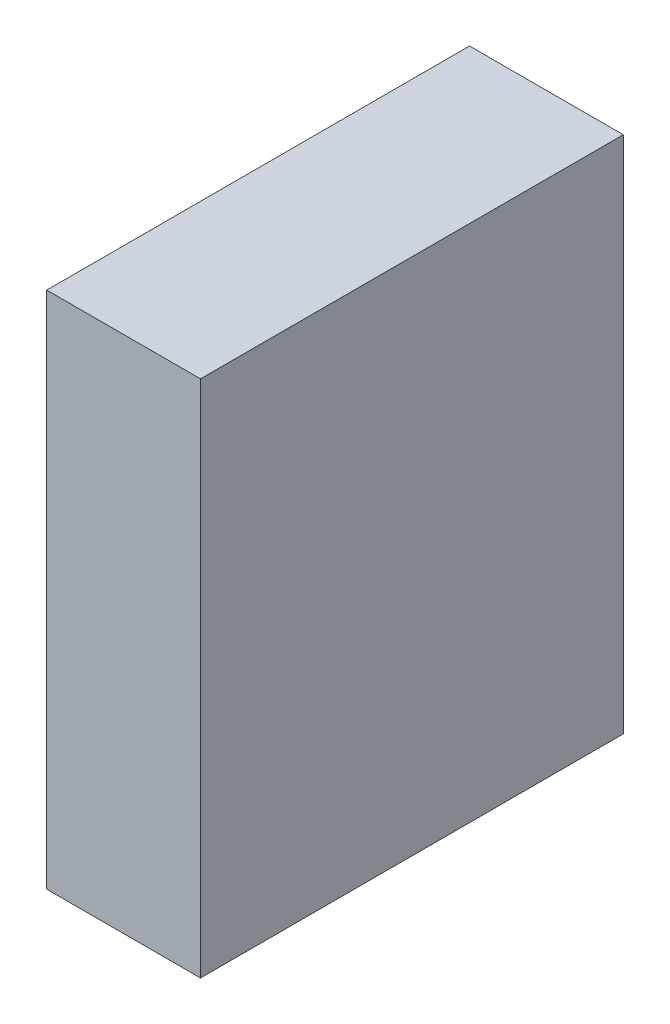
ISO-10303-21;
HEADER;
FILE_DESCRIPTION(('STEP AP214'),'2;1');
FILE_NAME('part.step','',(''),(''),'','','');
FILE_SCHEMA(('AUTOMOTIVE_DESIGN { 1 0 10303 214 1 1 1 1 }'));
ENDSEC;
DATA;
#1=APPLICATION_CONTEXT('core data for automotive mechanical design processes');
#2=APPLICATION_PROTOCOL_DEFINITION('international standard','automotive_design',2000,#1);
#3=PRODUCT_CONTEXT('',#1,'mechanical');
#4=PRODUCT('Part','Part','',(#3));
#5=PRODUCT_RELATED_PRODUCT_CATEGORY('part','',(#4));
#6=PRODUCT_DEFINITION_FORMATION('','',#4);
#7=PRODUCT_DEFINITION_CONTEXT('part definition',#1,'design');
#8=PRODUCT_DEFINITION('design','',#6,#7);
#9=PRODUCT_DEFINITION_SHAPE('','',#8);
#10=(LENGTH_UNIT() NAMED_UNIT(*) SI_UNIT(.MILLI.,.METRE.));
#11=(NAMED_UNIT(*) PLANE_ANGLE_UNIT() SI_UNIT($,.RADIAN.));
#12=(NAMED_UNIT(*) SI_UNIT($,.STERADIAN.) SOLID_ANGLE_UNIT());
#13=UNCERTAINTY_MEASURE_WITH_UNIT(LENGTH_MEASURE(1.E-05),#10,'distance_accuracy_value','');
#14=(GEOMETRIC_REPRESENTATION_CONTEXT(3) GLOBAL_UNCERTAINTY_ASSIGNED_CONTEXT((#13)) GLOBAL_UNIT_ASSIGNED_CONTEXT((#10,
#11,#12)) REPRESENTATION_CONTEXT('',''));
#15=CARTESIAN_POINT('',(0.,0.,0.));
#16=DIRECTION('',(0.,0.,1.));
#17=DIRECTION('',(1.,0.,0.));
#18=AXIS2_PLACEMENT_3D('',#15,#16,#17);
#19=CARTESIAN_POINT('',(-6.66666666666667,45.,-18.333333335));
#20=DIRECTION('',(0.,0.,-1.));
#21=DIRECTION('',(-1.,0.,0.));
#22=AXIS2_PLACEMENT_3D('',#19,#20,#21);
#23=PLANE('',#22);
#24=DIRECTION('',(1.,0.,0.));
#25=VECTOR('',#24,1.);
#26=CARTESIAN_POINT('',(-6.66666666666667,0.,-18.333333335));
#27=LINE('',#26,#25);
#28=CARTESIAN_POINT('',(-6.66666666666667,0.,-18.333333335));
#29=VERTEX_POINT('',#28);
#30=CARTESIAN_POINT('',(6.66666666666666,0.,-18.333333335));
#31=VERTEX_POINT('',#30);
#32=EDGE_CURVE('E116',#29,#31,#27,.T.);
#33=ORIENTED_EDGE('',*,*,#32,.F.);
#34=DIRECTION('',(0.,-1.,0.));
#35=VECTOR('',#34,1.);
#36=CARTESIAN_POINT('',(-6.66666666666667,45.,-18.333333335));
#37=LINE('',#36,#35);
#38=CARTESIAN_POINT('',(-6.66666666666667,45.,-18.333333335));
#39=VERTEX_POINT('',#38);
#40=EDGE_CURVE('E11',#39,#29,#37,.T.);
#41=ORIENTED_EDGE('',*,*,#40,.F.);
#42=DIRECTION('',(1.,0.,0.));
#43=VECTOR('',#42,1.);
#44=CARTESIAN_POINT('',(-6.66666666666667,45.,-18.333333335));
#45=LINE('',#44,#43);
#46=CARTESIAN_POINT('',(6.66666666666666,45.,-18.333333335));
#47=VERTEX_POINT('',#46);
#48=EDGE_CURVE('E109',#39,#47,#45,.T.);
#49=ORIENTED_EDGE('',*,*,#48,.T.);
#50=DIRECTION('',(0.,-1.,0.));
#51=VECTOR('',#50,1.);
#52=CARTESIAN_POINT('',(6.66666666666666,45.,-18.333333335));
#53=LINE('',#52,#51);
#54=EDGE_CURVE('E48',#47,#31,#53,.T.);
#55=ORIENTED_EDGE('',*,*,#54,.T.);
#56=EDGE_LOOP('',(#33,#41,#49,#55));
#57=FACE_BOUND('',#56,.T.);
#58=ADVANCED_FACE('F45',(#57),#23,.T.);
#59=CARTESIAN_POINT('',(-6.66666666666667,45.,-18.333333335));
#60=DIRECTION('',(1.,0.,0.));
#61=DIRECTION('',(0.,0.,-1.));
#62=AXIS2_PLACEMENT_3D('',#59,#60,#61);
#63=PLANE('',#62);
#64=DIRECTION('',(0.,0.,1.));
#65=VECTOR('',#64,1.);
#66=CARTESIAN_POINT('',(-6.66666666666667,0.,-18.333333335));
#67=LINE('',#66,#65);
#68=CARTESIAN_POINT('',(-6.66666666666666,0.,18.333333335));
#69=VERTEX_POINT('',#68);
#70=EDGE_CURVE('E79',#29,#69,#67,.T.);
#71=ORIENTED_EDGE('',*,*,#70,.T.);
#72=DIRECTION('',(0.,-1.,0.));
#73=VECTOR('',#72,1.);
#74=CARTESIAN_POINT('',(-6.66666666666666,45.,18.333333335));
#75=LINE('',#74,#73);
#76=CARTESIAN_POINT('',(-6.66666666666666,45.,18.333333335));
#77=VERTEX_POINT('',#76);
#78=EDGE_CURVE('E55',#77,#69,#75,.T.);
#79=ORIENTED_EDGE('',*,*,#78,.F.);
#80=DIRECTION('',(0.,0.,1.));
#81=VECTOR('',#80,1.);
#82=CARTESIAN_POINT('',(-6.66666666666667,45.,-18.333333335));
#83=LINE('',#82,#81);
#84=EDGE_CURVE('E96',#39,#77,#83,.T.);
#85=ORIENTED_EDGE('',*,*,#84,.F.);
#86=ORIENTED_EDGE('',*,*,#40,.T.);
#87=EDGE_LOOP('',(#71,#79,#85,#86));
#88=FACE_BOUND('',#87,.T.);
#89=ADVANCED_FACE('F132',(#88),#63,.F.);
#90=CARTESIAN_POINT('',(-6.66666666666666,45.,18.333333335));
#91=DIRECTION('',(0.,0.,-1.));
#92=DIRECTION('',(-1.,0.,0.));
#93=AXIS2_PLACEMENT_3D('',#90,#91,#92);
#94=PLANE('',#93);
#95=DIRECTION('',(1.,0.,0.));
#96=VECTOR('',#95,1.);
#97=CARTESIAN_POINT('',(-6.66666666666666,0.,18.333333335));
#98=LINE('',#97,#96);
#99=CARTESIAN_POINT('',(6.66666666666667,0.,18.333333335));
#100=VERTEX_POINT('',#99);
#101=EDGE_CURVE('E104',#69,#100,#98,.T.);
#102=ORIENTED_EDGE('',*,*,#101,.T.);
#103=DIRECTION('',(0.,-1.,0.));
#104=VECTOR('',#103,1.);
#105=CARTESIAN_POINT('',(6.66666666666667,45.,18.333333335));
#106=LINE('',#105,#104);
#107=CARTESIAN_POINT('',(6.66666666666667,45.,18.333333335));
#108=VERTEX_POINT('',#107);
#109=EDGE_CURVE('E101',#108,#100,#106,.T.);
#110=ORIENTED_EDGE('',*,*,#109,.F.);
#111=DIRECTION('',(1.,0.,0.));
#112=VECTOR('',#111,1.);
#113=CARTESIAN_POINT('',(-6.66666666666666,45.,18.333333335));
#114=LINE('',#113,#112);
#115=EDGE_CURVE('E91',#77,#108,#114,.T.);
#116=ORIENTED_EDGE('',*,*,#115,.F.);
#117=ORIENTED_EDGE('',*,*,#78,.T.);
#118=EDGE_LOOP('',(#102,#110,#116,#117));
#119=FACE_BOUND('',#118,.T.);
#120=ADVANCED_FACE('F102',(#119),#94,.F.);
#121=CARTESIAN_POINT('',(6.66666666666666,45.,-18.333333335));
#122=DIRECTION('',(1.,0.,0.));
#123=DIRECTION('',(0.,0.,-1.));
#124=AXIS2_PLACEMENT_3D('',#121,#122,#123);
#125=PLANE('',#124);
#126=DIRECTION('',(0.,0.,1.));
#127=VECTOR('',#126,1.);
#128=CARTESIAN_POINT('',(6.66666666666666,0.,-18.333333335));
#129=LINE('',#128,#127);
#130=EDGE_CURVE('E120',#31,#100,#129,.T.);
#131=ORIENTED_EDGE('',*,*,#130,.F.);
#132=ORIENTED_EDGE('',*,*,#54,.F.);
#133=DIRECTION('',(0.,0.,1.));
#134=VECTOR('',#133,1.);
#135=CARTESIAN_POINT('',(6.66666666666666,45.,-18.333333335));
#136=LINE('',#135,#134);
#137=EDGE_CURVE('E95',#47,#108,#136,.T.);
#138=ORIENTED_EDGE('',*,*,#137,.T.);
#139=ORIENTED_EDGE('',*,*,#109,.T.);
#140=EDGE_LOOP('',(#131,#132,#138,#139));
#141=FACE_BOUND('',#140,.T.);
#142=ADVANCED_FACE('F107',(#141),#125,.T.);
#143=CARTESIAN_POINT('',(0.,45.,0.));
#144=DIRECTION('',(0.,-1.,0.));
#145=DIRECTION('',(0.,0.,-1.));
#146=AXIS2_PLACEMENT_3D('',#143,#144,#145);
#147=PLANE('',#146);
#148=ORIENTED_EDGE('',*,*,#48,.F.);
#149=ORIENTED_EDGE('',*,*,#84,.T.);
#150=ORIENTED_EDGE('',*,*,#115,.T.);
#151=ORIENTED_EDGE('',*,*,#137,.F.);
#152=EDGE_LOOP('',(#148,#149,#150,#151));
#153=FACE_BOUND('',#152,.T.);
#154=ADVANCED_FACE('F94',(#153),#147,.F.);
#155=CARTESIAN_POINT('',(0.,0.,0.));
#156=DIRECTION('',(0.,-1.,0.));
#157=DIRECTION('',(0.,0.,-1.));
#158=AXIS2_PLACEMENT_3D('',#155,#156,#157);
#159=PLANE('',#158);
#160=ORIENTED_EDGE('',*,*,#32,.T.);
#161=ORIENTED_EDGE('',*,*,#130,.T.);
#162=ORIENTED_EDGE('',*,*,#101,.F.);
#163=ORIENTED_EDGE('',*,*,#70,.F.);
#164=EDGE_LOOP('',(#160,#161,#162,#163));
#165=FACE_BOUND('',#164,.T.);
#166=ADVANCED_FACE('F129',(#165),#159,.T.);
#167=CLOSED_SHELL('',(#58,#89,#120,#142,#154,#166));
#168=MANIFOLD_SOLID_BREP('B2',#167);
#169=ADVANCED_BREP_SHAPE_REPRESENTATION('',(#18,#168),#14);
#170=SHAPE_DEFINITION_REPRESENTATION(#9,#169);
ENDSEC;
END-ISO-10303-21;
